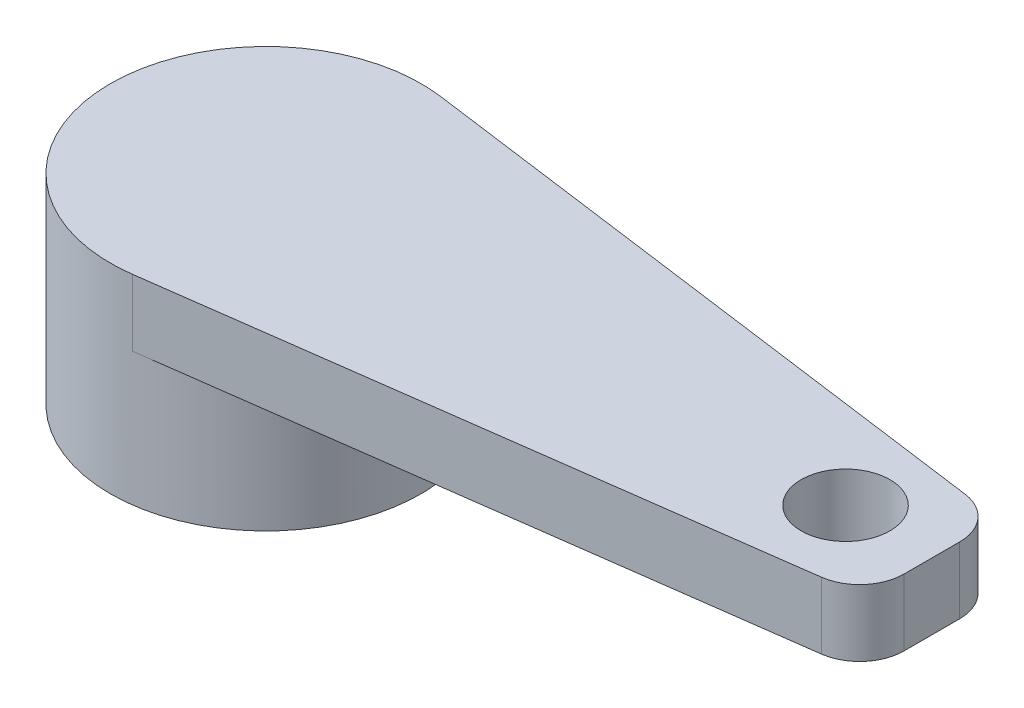
ISO-10303-21;
HEADER;
FILE_DESCRIPTION(('STEP AP214'),'2;1');
FILE_NAME('part.step','',(''),(''),'','','');
FILE_SCHEMA(('AUTOMOTIVE_DESIGN { 1 0 10303 214 1 1 1 1 }'));
ENDSEC;
DATA;
#1=APPLICATION_CONTEXT('core data for automotive mechanical design processes');
#2=APPLICATION_PROTOCOL_DEFINITION('international standard','automotive_design',2000,#1);
#3=PRODUCT_CONTEXT('',#1,'mechanical');
#4=PRODUCT('Part','Part','',(#3));
#5=PRODUCT_RELATED_PRODUCT_CATEGORY('part','',(#4));
#6=PRODUCT_DEFINITION_FORMATION('','',#4);
#7=PRODUCT_DEFINITION_CONTEXT('part definition',#1,'design');
#8=PRODUCT_DEFINITION('design','',#6,#7);
#9=PRODUCT_DEFINITION_SHAPE('','',#8);
#10=(LENGTH_UNIT() NAMED_UNIT(*) SI_UNIT(.MILLI.,.METRE.));
#11=(NAMED_UNIT(*) PLANE_ANGLE_UNIT() SI_UNIT($,.RADIAN.));
#12=(NAMED_UNIT(*) SI_UNIT($,.STERADIAN.) SOLID_ANGLE_UNIT());
#13=UNCERTAINTY_MEASURE_WITH_UNIT(LENGTH_MEASURE(1.E-05),#10,'distance_accuracy_value','');
#14=(GEOMETRIC_REPRESENTATION_CONTEXT(3) GLOBAL_UNCERTAINTY_ASSIGNED_CONTEXT((#13)) GLOBAL_UNIT_ASSIGNED_CONTEXT((#10,
#11,#12)) REPRESENTATION_CONTEXT('',''));
#15=CARTESIAN_POINT('',(0.,0.,0.));
#16=DIRECTION('',(0.,0.,1.));
#17=DIRECTION('',(1.,0.,0.));
#18=AXIS2_PLACEMENT_3D('',#15,#16,#17);
#19=CARTESIAN_POINT('',(0.,3.,0.));
#20=DIRECTION('',(0.,-1.,0.));
#21=DIRECTION('',(0.,0.,-1.));
#22=AXIS2_PLACEMENT_3D('',#19,#20,#21);
#23=CYLINDRICAL_SURFACE('',#22,3.5);
#24=CARTESIAN_POINT('',(0.,3.,0.));
#25=DIRECTION('',(0.,1.,0.));
#26=DIRECTION('',(0.,0.,1.));
#27=AXIS2_PLACEMENT_3D('',#24,#25,#26);
#28=CIRCLE('',#27,3.5);
#29=CARTESIAN_POINT('',(0.469834494751468,3.,3.46832171915203));
#30=VERTEX_POINT('',#29);
#31=CARTESIAN_POINT('',(0.469834494751465,3.,-3.46832171915202));
#32=VERTEX_POINT('',#31);
#33=EDGE_CURVE('E106',#30,#32,#28,.T.);
#34=ORIENTED_EDGE('',*,*,#33,.F.);
#35=DIRECTION('',(0.,-1.,0.));
#36=VECTOR('',#35,1.);
#37=CARTESIAN_POINT('',(0.469834494751468,4.5,3.46832171915203));
#38=LINE('',#37,#36);
#39=CARTESIAN_POINT('',(0.469834494751468,4.5,3.46832171915203));
#40=VERTEX_POINT('',#39);
#41=EDGE_CURVE('E91',#40,#30,#38,.T.);
#42=ORIENTED_EDGE('',*,*,#41,.F.);
#43=CARTESIAN_POINT('',(0.,4.5,0.));
#44=DIRECTION('',(0.,1.,0.));
#45=DIRECTION('',(0.,0.,1.));
#46=AXIS2_PLACEMENT_3D('',#43,#44,#45);
#47=CIRCLE('',#46,3.50000000000001);
#48=CARTESIAN_POINT('',(0.469834494751465,4.5,-3.46832171915202));
#49=VERTEX_POINT('',#48);
#50=EDGE_CURVE('E94',#49,#40,#47,.T.);
#51=ORIENTED_EDGE('',*,*,#50,.F.);
#52=DIRECTION('',(0.,-1.,0.));
#53=VECTOR('',#52,1.);
#54=CARTESIAN_POINT('',(0.469834494751465,4.5,-3.46832171915202));
#55=LINE('',#54,#53);
#56=EDGE_CURVE('E109',#49,#32,#55,.T.);
#57=ORIENTED_EDGE('',*,*,#56,.T.);
#58=EDGE_LOOP('',(#34,#42,#51,#57));
#59=FACE_BOUND('',#58,.T.);
#60=CARTESIAN_POINT('',(0.,0.,0.));
#61=DIRECTION('',(0.,1.,0.));
#62=DIRECTION('',(0.,0.,1.));
#63=AXIS2_PLACEMENT_3D('',#60,#61,#62);
#64=CIRCLE('',#63,3.5);
#65=CARTESIAN_POINT('',(0.,0.,3.5));
#66=VERTEX_POINT('',#65);
#67=EDGE_CURVE('E108',#66,#66,#64,.T.);
#68=ORIENTED_EDGE('',*,*,#67,.T.);
#69=EDGE_LOOP('',(#68));
#70=FACE_BOUND('',#69,.T.);
#71=ADVANCED_FACE('F34',(#59,#70),#23,.T.);
#72=CARTESIAN_POINT('',(0.,0.,0.));
#73=DIRECTION('',(0.,1.,0.));
#74=DIRECTION('',(0.,0.,1.));
#75=AXIS2_PLACEMENT_3D('',#72,#73,#74);
#76=PLANE('',#75);
#77=CARTESIAN_POINT('',(0.,0.,0.));
#78=DIRECTION('',(0.,-1.,0.));
#79=DIRECTION('',(0.,0.,-1.));
#80=AXIS2_PLACEMENT_3D('',#77,#78,#79);
#81=CIRCLE('',#80,2.5);
#82=CARTESIAN_POINT('',(0.,0.,-2.5));
#83=VERTEX_POINT('',#82);
#84=EDGE_CURVE('E145',#83,#83,#81,.T.);
#85=ORIENTED_EDGE('',*,*,#84,.F.);
#86=EDGE_LOOP('',(#85));
#87=FACE_BOUND('',#86,.T.);
#88=ORIENTED_EDGE('',*,*,#67,.F.);
#89=EDGE_LOOP('',(#88));
#90=FACE_BOUND('',#89,.T.);
#91=ADVANCED_FACE('F163',(#87,#90),#76,.F.);
#92=CARTESIAN_POINT('',(0.,3.,0.));
#93=DIRECTION('',(0.,1.,0.));
#94=DIRECTION('',(0.,0.,1.));
#95=AXIS2_PLACEMENT_3D('',#92,#93,#94);
#96=PLANE('',#95);
#97=CARTESIAN_POINT('',(13.,3.,-0.0554018870769409));
#98=DIRECTION('',(0.,1.,0.));
#99=DIRECTION('',(0.,0.,1.));
#100=AXIS2_PLACEMENT_3D('',#97,#98,#99);
#101=CIRCLE('',#100,1.);
#102=CARTESIAN_POINT('',(13.,3.,0.944598112923061));
#103=VERTEX_POINT('',#102);
#104=EDGE_CURVE('E195',#103,#103,#101,.T.);
#105=ORIENTED_EDGE('',*,*,#104,.T.);
#106=EDGE_LOOP('',(#105));
#107=FACE_BOUND('',#106,.T.);
#108=DIRECTION('',(0.,0.,-1.));
#109=VECTOR('',#108,1.);
#110=CARTESIAN_POINT('',(15.,3.,-1.5));
#111=LINE('',#110,#109);
#112=CARTESIAN_POINT('',(15.,3.,0.626330902777557));
#113=VERTEX_POINT('',#112);
#114=CARTESIAN_POINT('',(15.,3.,-0.626330902777559));
#115=VERTEX_POINT('',#114);
#116=EDGE_CURVE('E140',#113,#115,#111,.T.);
#117=ORIENTED_EDGE('',*,*,#116,.F.);
#118=CARTESIAN_POINT('',(14.,3.,0.626330902777558));
#119=DIRECTION('',(0.,1.,0.));
#120=DIRECTION('',(0.,0.,1.));
#121=AXIS2_PLACEMENT_3D('',#118,#119,#120);
#122=CIRCLE('',#121,1.);
#123=CARTESIAN_POINT('',(14.1342384270718,3.,1.61727996539242));
#124=VERTEX_POINT('',#123);
#125=EDGE_CURVE('E124',#113,#124,#122,.F.);
#126=ORIENTED_EDGE('',*,*,#125,.T.);
#127=DIRECTION('',(0.990949062614863,0.,-0.134238427071848));
#128=VECTOR('',#127,1.);
#129=CARTESIAN_POINT('',(15.,3.,1.5));
#130=LINE('',#129,#128);
#131=EDGE_CURVE('E139',#30,#124,#130,.T.);
#132=ORIENTED_EDGE('',*,*,#131,.F.);
#133=ORIENTED_EDGE('',*,*,#33,.T.);
#134=DIRECTION('',(-0.990949062614863,0.,-0.134238427071847));
#135=VECTOR('',#134,1.);
#136=CARTESIAN_POINT('',(0.469834494751465,3.,-3.46832171915202));
#137=LINE('',#136,#135);
#138=CARTESIAN_POINT('',(14.1342384270718,3.,-1.61727996539242));
#139=VERTEX_POINT('',#138);
#140=EDGE_CURVE('E102',#139,#32,#137,.T.);
#141=ORIENTED_EDGE('',*,*,#140,.F.);
#142=CARTESIAN_POINT('',(14.,3.,-0.626330902777558));
#143=DIRECTION('',(0.,1.,0.));
#144=DIRECTION('',(0.,0.,1.));
#145=AXIS2_PLACEMENT_3D('',#142,#143,#144);
#146=CIRCLE('',#145,1.);
#147=EDGE_CURVE('E122',#139,#115,#146,.F.);
#148=ORIENTED_EDGE('',*,*,#147,.T.);
#149=EDGE_LOOP('',(#117,#126,#132,#133,#141,#148));
#150=FACE_BOUND('',#149,.T.);
#151=ADVANCED_FACE('F138',(#107,#150),#96,.F.);
#152=CARTESIAN_POINT('',(15.,4.5,1.5));
#153=DIRECTION('',(-0.134238427071848,0.,-0.990949062614863));
#154=DIRECTION('',(-0.990949062614863,0.,0.134238427071848));
#155=AXIS2_PLACEMENT_3D('',#152,#153,#154);
#156=PLANE('',#155);
#157=ORIENTED_EDGE('',*,*,#131,.T.);
#158=DIRECTION('',(0.,-1.,0.));
#159=VECTOR('',#158,1.);
#160=CARTESIAN_POINT('',(14.1342384270718,4.5,1.61727996539242));
#161=LINE('',#160,#159);
#162=CARTESIAN_POINT('',(14.1342384270718,4.5,1.61727996539242));
#163=VERTEX_POINT('',#162);
#164=EDGE_CURVE('E57',#124,#163,#161,.F.);
#165=ORIENTED_EDGE('',*,*,#164,.T.);
#166=DIRECTION('',(0.990949062614863,0.,-0.134238427071848));
#167=VECTOR('',#166,1.);
#168=CARTESIAN_POINT('',(15.,4.5,1.5));
#169=LINE('',#168,#167);
#170=EDGE_CURVE('E87',#40,#163,#169,.T.);
#171=ORIENTED_EDGE('',*,*,#170,.F.);
#172=ORIENTED_EDGE('',*,*,#41,.T.);
#173=EDGE_LOOP('',(#157,#165,#171,#172));
#174=FACE_BOUND('',#173,.T.);
#175=ADVANCED_FACE('F89',(#174),#156,.F.);
#176=CARTESIAN_POINT('',(15.,4.5,-1.5));
#177=DIRECTION('',(-1.,0.,0.));
#178=DIRECTION('',(0.,0.,1.));
#179=AXIS2_PLACEMENT_3D('',#176,#177,#178);
#180=PLANE('',#179);
#181=DIRECTION('',(0.,0.,-1.));
#182=VECTOR('',#181,1.);
#183=CARTESIAN_POINT('',(15.,4.5,-1.5));
#184=LINE('',#183,#182);
#185=CARTESIAN_POINT('',(15.,4.5,0.626330902777557));
#186=VERTEX_POINT('',#185);
#187=CARTESIAN_POINT('',(15.,4.5,-0.626330902777559));
#188=VERTEX_POINT('',#187);
#189=EDGE_CURVE('E93',#186,#188,#184,.T.);
#190=ORIENTED_EDGE('',*,*,#189,.F.);
#191=DIRECTION('',(0.,-1.,0.));
#192=VECTOR('',#191,1.);
#193=CARTESIAN_POINT('',(15.,4.5,0.626330902777557));
#194=LINE('',#193,#192);
#195=EDGE_CURVE('E119',#186,#113,#194,.T.);
#196=ORIENTED_EDGE('',*,*,#195,.T.);
#197=ORIENTED_EDGE('',*,*,#116,.T.);
#198=DIRECTION('',(0.,-1.,0.));
#199=VECTOR('',#198,1.);
#200=CARTESIAN_POINT('',(15.,4.5,-0.626330902777559));
#201=LINE('',#200,#199);
#202=EDGE_CURVE('E116',#115,#188,#201,.F.);
#203=ORIENTED_EDGE('',*,*,#202,.T.);
#204=EDGE_LOOP('',(#190,#196,#197,#203));
#205=FACE_BOUND('',#204,.T.);
#206=ADVANCED_FACE('F131',(#205),#180,.F.);
#207=CARTESIAN_POINT('',(0.469834494751465,4.5,-3.46832171915202));
#208=DIRECTION('',(-0.134238427071847,0.,0.990949062614863));
#209=DIRECTION('',(0.990949062614863,0.,0.134238427071847));
#210=AXIS2_PLACEMENT_3D('',#207,#208,#209);
#211=PLANE('',#210);
#212=DIRECTION('',(-0.990949062614863,0.,-0.134238427071847));
#213=VECTOR('',#212,1.);
#214=CARTESIAN_POINT('',(0.469834494751465,4.5,-3.46832171915202));
#215=LINE('',#214,#213);
#216=CARTESIAN_POINT('',(14.1342384270718,4.5,-1.61727996539242));
#217=VERTEX_POINT('',#216);
#218=EDGE_CURVE('E98',#217,#49,#215,.T.);
#219=ORIENTED_EDGE('',*,*,#218,.F.);
#220=DIRECTION('',(0.,-1.,0.));
#221=VECTOR('',#220,1.);
#222=CARTESIAN_POINT('',(14.1342384270718,4.5,-1.61727996539242));
#223=LINE('',#222,#221);
#224=EDGE_CURVE('E11',#217,#139,#223,.T.);
#225=ORIENTED_EDGE('',*,*,#224,.T.);
#226=ORIENTED_EDGE('',*,*,#140,.T.);
#227=ORIENTED_EDGE('',*,*,#56,.F.);
#228=EDGE_LOOP('',(#219,#225,#226,#227));
#229=FACE_BOUND('',#228,.T.);
#230=ADVANCED_FACE('F150',(#229),#211,.F.);
#231=CARTESIAN_POINT('',(0.,4.5,0.));
#232=DIRECTION('',(0.,1.,0.));
#233=DIRECTION('',(0.,0.,1.));
#234=AXIS2_PLACEMENT_3D('',#231,#232,#233);
#235=PLANE('',#234);
#236=CARTESIAN_POINT('',(13.,4.5,-0.0554018870769409));
#237=DIRECTION('',(0.,1.,0.));
#238=DIRECTION('',(0.,0.,1.));
#239=AXIS2_PLACEMENT_3D('',#236,#237,#238);
#240=CIRCLE('',#239,1.);
#241=CARTESIAN_POINT('',(13.,4.5,0.944598112923061));
#242=VERTEX_POINT('',#241);
#243=EDGE_CURVE('E198',#242,#242,#240,.T.);
#244=ORIENTED_EDGE('',*,*,#243,.F.);
#245=EDGE_LOOP('',(#244));
#246=FACE_BOUND('',#245,.T.);
#247=ORIENTED_EDGE('',*,*,#170,.T.);
#248=CARTESIAN_POINT('',(14.,4.5,0.626330902777558));
#249=DIRECTION('',(0.,1.,0.));
#250=DIRECTION('',(0.,0.,1.));
#251=AXIS2_PLACEMENT_3D('',#248,#249,#250);
#252=CIRCLE('',#251,1.);
#253=EDGE_CURVE('E42',#163,#186,#252,.T.);
#254=ORIENTED_EDGE('',*,*,#253,.T.);
#255=ORIENTED_EDGE('',*,*,#189,.T.);
#256=CARTESIAN_POINT('',(14.,4.5,-0.626330902777558));
#257=DIRECTION('',(0.,1.,0.));
#258=DIRECTION('',(0.,0.,1.));
#259=AXIS2_PLACEMENT_3D('',#256,#257,#258);
#260=CIRCLE('',#259,1.);
#261=EDGE_CURVE('E49',#188,#217,#260,.T.);
#262=ORIENTED_EDGE('',*,*,#261,.T.);
#263=ORIENTED_EDGE('',*,*,#218,.T.);
#264=ORIENTED_EDGE('',*,*,#50,.T.);
#265=EDGE_LOOP('',(#247,#254,#255,#262,#263,#264));
#266=FACE_BOUND('',#265,.T.);
#267=ADVANCED_FACE('F97',(#246,#266),#235,.T.);
#268=CARTESIAN_POINT('',(0.,2.,0.));
#269=DIRECTION('',(0.,-1.,0.));
#270=DIRECTION('',(0.,0.,-1.));
#271=AXIS2_PLACEMENT_3D('',#268,#269,#270);
#272=CYLINDRICAL_SURFACE('',#271,2.5);
#273=CARTESIAN_POINT('',(0.,2.,0.));
#274=DIRECTION('',(0.,-1.,0.));
#275=DIRECTION('',(0.,0.,-1.));
#276=AXIS2_PLACEMENT_3D('',#273,#274,#275);
#277=CIRCLE('',#276,2.5);
#278=CARTESIAN_POINT('',(0.,2.,-2.5));
#279=VERTEX_POINT('',#278);
#280=EDGE_CURVE('E141',#279,#279,#277,.T.);
#281=ORIENTED_EDGE('',*,*,#280,.F.);
#282=EDGE_LOOP('',(#281));
#283=FACE_BOUND('',#282,.T.);
#284=ORIENTED_EDGE('',*,*,#84,.T.);
#285=EDGE_LOOP('',(#284));
#286=FACE_BOUND('',#285,.T.);
#287=ADVANCED_FACE('F182',(#283,#286),#272,.F.);
#288=CARTESIAN_POINT('',(0.,2.,0.));
#289=DIRECTION('',(0.,-1.,0.));
#290=DIRECTION('',(0.,0.,-1.));
#291=AXIS2_PLACEMENT_3D('',#288,#289,#290);
#292=PLANE('',#291);
#293=ORIENTED_EDGE('',*,*,#280,.T.);
#294=EDGE_LOOP('',(#293));
#295=FACE_BOUND('',#294,.T.);
#296=ADVANCED_FACE('F161',(#295),#292,.T.);
#297=CARTESIAN_POINT('',(14.,4.5,0.626330902777558));
#298=DIRECTION('',(0.,-1.,0.));
#299=DIRECTION('',(0.,0.,-1.));
#300=AXIS2_PLACEMENT_3D('',#297,#298,#299);
#301=CYLINDRICAL_SURFACE('',#300,1.);
#302=ORIENTED_EDGE('',*,*,#253,.F.);
#303=ORIENTED_EDGE('',*,*,#164,.F.);
#304=ORIENTED_EDGE('',*,*,#125,.F.);
#305=ORIENTED_EDGE('',*,*,#195,.F.);
#306=EDGE_LOOP('',(#302,#303,#304,#305));
#307=FACE_BOUND('',#306,.T.);
#308=ADVANCED_FACE('F136',(#307),#301,.T.);
#309=CARTESIAN_POINT('',(14.,4.5,-0.626330902777558));
#310=DIRECTION('',(0.,-1.,0.));
#311=DIRECTION('',(0.,0.,-1.));
#312=AXIS2_PLACEMENT_3D('',#309,#310,#311);
#313=CYLINDRICAL_SURFACE('',#312,1.);
#314=ORIENTED_EDGE('',*,*,#261,.F.);
#315=ORIENTED_EDGE('',*,*,#202,.F.);
#316=ORIENTED_EDGE('',*,*,#147,.F.);
#317=ORIENTED_EDGE('',*,*,#224,.F.);
#318=EDGE_LOOP('',(#314,#315,#316,#317));
#319=FACE_BOUND('',#318,.T.);
#320=ADVANCED_FACE('F36',(#319),#313,.T.);
#321=CARTESIAN_POINT('',(13.,0.,-0.0554018870769409));
#322=DIRECTION('',(0.,1.,0.));
#323=DIRECTION('',(0.,0.,1.));
#324=AXIS2_PLACEMENT_3D('',#321,#322,#323);
#325=CYLINDRICAL_SURFACE('',#324,1.);
#326=ORIENTED_EDGE('',*,*,#243,.T.);
#327=EDGE_LOOP('',(#326));
#328=FACE_BOUND('',#327,.T.);
#329=ORIENTED_EDGE('',*,*,#104,.F.);
#330=EDGE_LOOP('',(#329));
#331=FACE_BOUND('',#330,.T.);
#332=ADVANCED_FACE('F154',(#328,#331),#325,.F.);
#333=CLOSED_SHELL('',(#71,#91,#151,#175,#206,#230,#267,#287,#296,#308,#320,#332));
#334=MANIFOLD_SOLID_BREP('B2',#333);
#335=ADVANCED_BREP_SHAPE_REPRESENTATION('',(#18,#334),#14);
#336=SHAPE_DEFINITION_REPRESENTATION(#9,#335);
ENDSEC;
END-ISO-10303-21;
